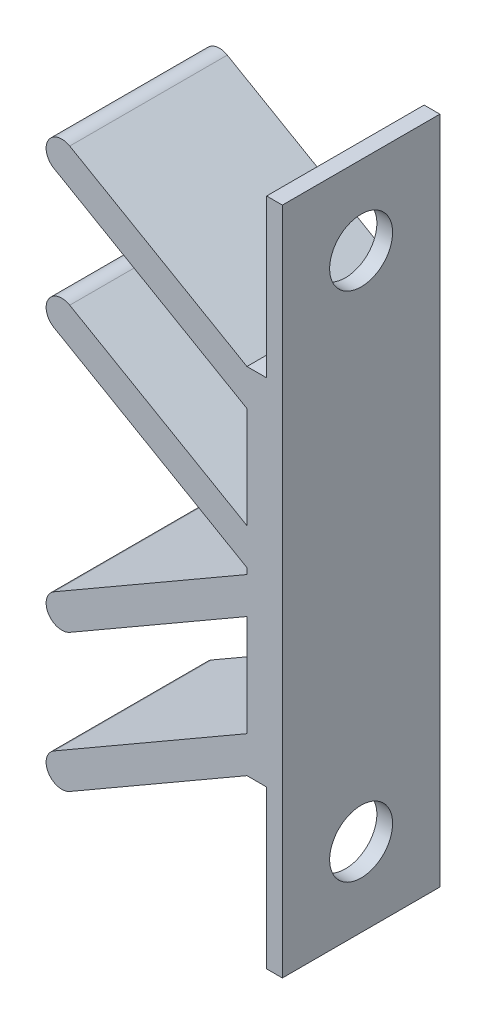
ISO-10303-21;
HEADER;
FILE_DESCRIPTION(('STEP AP214'),'2;1');
FILE_NAME('part.step','',(''),(''),'','','');
FILE_SCHEMA(('AUTOMOTIVE_DESIGN { 1 0 10303 214 1 1 1 1 }'));
ENDSEC;
DATA;
#1=APPLICATION_CONTEXT('core data for automotive mechanical design processes');
#2=APPLICATION_PROTOCOL_DEFINITION('international standard','automotive_design',2000,#1);
#3=PRODUCT_CONTEXT('',#1,'mechanical');
#4=PRODUCT('Part','Part','',(#3));
#5=PRODUCT_RELATED_PRODUCT_CATEGORY('part','',(#4));
#6=PRODUCT_DEFINITION_FORMATION('','',#4);
#7=PRODUCT_DEFINITION_CONTEXT('part definition',#1,'design');
#8=PRODUCT_DEFINITION('design','',#6,#7);
#9=PRODUCT_DEFINITION_SHAPE('','',#8);
#10=(LENGTH_UNIT() NAMED_UNIT(*) SI_UNIT(.MILLI.,.METRE.));
#11=(NAMED_UNIT(*) PLANE_ANGLE_UNIT() SI_UNIT($,.RADIAN.));
#12=(NAMED_UNIT(*) SI_UNIT($,.STERADIAN.) SOLID_ANGLE_UNIT());
#13=UNCERTAINTY_MEASURE_WITH_UNIT(LENGTH_MEASURE(1.E-05),#10,'distance_accuracy_value','');
#14=(GEOMETRIC_REPRESENTATION_CONTEXT(3) GLOBAL_UNCERTAINTY_ASSIGNED_CONTEXT((#13)) GLOBAL_UNIT_ASSIGNED_CONTEXT((#10,
#11,#12)) REPRESENTATION_CONTEXT('',''));
#15=CARTESIAN_POINT('',(0.,0.,0.));
#16=DIRECTION('',(0.,0.,1.));
#17=DIRECTION('',(1.,0.,0.));
#18=AXIS2_PLACEMENT_3D('',#15,#16,#17);
#19=CARTESIAN_POINT('',(6.17541167950552,-16.649176640989,8.));
#20=DIRECTION('',(-1.,0.,0.));
#21=DIRECTION('',(0.,0.,1.));
#22=AXIS2_PLACEMENT_3D('',#19,#20,#21);
#23=PLANE('',#22);
#24=CARTESIAN_POINT('',(6.17541167950552,13.350823359011,4.));
#25=DIRECTION('',(-1.,0.,0.));
#26=DIRECTION('',(0.,0.,1.));
#27=AXIS2_PLACEMENT_3D('',#24,#25,#26);
#28=CIRCLE('',#27,1.6);
#29=CARTESIAN_POINT('',(6.17541167950552,13.350823359011,5.6));
#30=VERTEX_POINT('',#29);
#31=EDGE_CURVE('E234',#30,#30,#28,.T.);
#32=ORIENTED_EDGE('',*,*,#31,.T.);
#33=EDGE_LOOP('',(#32));
#34=FACE_BOUND('',#33,.T.);
#35=CARTESIAN_POINT('',(6.17541167950552,-12.649176640989,4.));
#36=DIRECTION('',(-1.,0.,0.));
#37=DIRECTION('',(0.,0.,1.));
#38=AXIS2_PLACEMENT_3D('',#35,#36,#37);
#39=CIRCLE('',#38,1.6);
#40=CARTESIAN_POINT('',(6.17541167950552,-12.649176640989,5.6));
#41=VERTEX_POINT('',#40);
#42=EDGE_CURVE('E418',#41,#41,#39,.T.);
#43=ORIENTED_EDGE('',*,*,#42,.T.);
#44=EDGE_LOOP('',(#43));
#45=FACE_BOUND('',#44,.T.);
#46=DIRECTION('',(0.,1.,0.));
#47=VECTOR('',#46,1.);
#48=CARTESIAN_POINT('',(6.17541167950552,-16.649176640989,0.));
#49=LINE('',#48,#47);
#50=CARTESIAN_POINT('',(6.17541167950552,-16.649176640989,0.));
#51=VERTEX_POINT('',#50);
#52=CARTESIAN_POINT('',(6.17541167950552,17.350823359011,0.));
#53=VERTEX_POINT('',#52);
#54=EDGE_CURVE('E231',#51,#53,#49,.T.);
#55=ORIENTED_EDGE('',*,*,#54,.T.);
#56=DIRECTION('',(0.,0.,-1.));
#57=VECTOR('',#56,1.);
#58=CARTESIAN_POINT('',(6.17541167950552,17.350823359011,8.));
#59=LINE('',#58,#57);
#60=CARTESIAN_POINT('',(6.17541167950552,17.350823359011,8.));
#61=VERTEX_POINT('',#60);
#62=EDGE_CURVE('E13',#61,#53,#59,.T.);
#63=ORIENTED_EDGE('',*,*,#62,.F.);
#64=DIRECTION('',(0.,1.,0.));
#65=VECTOR('',#64,1.);
#66=CARTESIAN_POINT('',(6.17541167950552,-16.649176640989,8.));
#67=LINE('',#66,#65);
#68=CARTESIAN_POINT('',(6.17541167950552,-16.649176640989,8.));
#69=VERTEX_POINT('',#68);
#70=EDGE_CURVE('E273',#69,#61,#67,.T.);
#71=ORIENTED_EDGE('',*,*,#70,.F.);
#72=DIRECTION('',(0.,0.,-1.));
#73=VECTOR('',#72,1.);
#74=CARTESIAN_POINT('',(6.17541167950552,-16.649176640989,8.));
#75=LINE('',#74,#73);
#76=EDGE_CURVE('E230',#69,#51,#75,.T.);
#77=ORIENTED_EDGE('',*,*,#76,.T.);
#78=EDGE_LOOP('',(#55,#63,#71,#77));
#79=FACE_BOUND('',#78,.T.);
#80=ADVANCED_FACE('F51',(#34,#45,#79),#23,.F.);
#81=CARTESIAN_POINT('',(5.37541167950552,17.350823359011,8.));
#82=DIRECTION('',(0.,-1.,0.));
#83=DIRECTION('',(0.,0.,-1.));
#84=AXIS2_PLACEMENT_3D('',#81,#82,#83);
#85=PLANE('',#84);
#86=DIRECTION('',(-1.,0.,0.));
#87=VECTOR('',#86,1.);
#88=CARTESIAN_POINT('',(5.37541167950552,17.350823359011,0.));
#89=LINE('',#88,#87);
#90=CARTESIAN_POINT('',(5.37541167950552,17.350823359011,0.));
#91=VERTEX_POINT('',#90);
#92=EDGE_CURVE('E233',#53,#91,#89,.T.);
#93=ORIENTED_EDGE('',*,*,#92,.T.);
#94=DIRECTION('',(0.,0.,-1.));
#95=VECTOR('',#94,1.);
#96=CARTESIAN_POINT('',(5.37541167950552,17.350823359011,8.));
#97=LINE('',#96,#95);
#98=CARTESIAN_POINT('',(5.37541167950552,17.350823359011,8.));
#99=VERTEX_POINT('',#98);
#100=EDGE_CURVE('E56',#99,#91,#97,.T.);
#101=ORIENTED_EDGE('',*,*,#100,.F.);
#102=DIRECTION('',(-1.,0.,0.));
#103=VECTOR('',#102,1.);
#104=CARTESIAN_POINT('',(5.37541167950552,17.350823359011,8.));
#105=LINE('',#104,#103);
#106=EDGE_CURVE('E155',#61,#99,#105,.T.);
#107=ORIENTED_EDGE('',*,*,#106,.F.);
#108=ORIENTED_EDGE('',*,*,#62,.T.);
#109=EDGE_LOOP('',(#93,#101,#107,#108));
#110=FACE_BOUND('',#109,.T.);
#111=ADVANCED_FACE('F404',(#110),#85,.F.);
#112=CARTESIAN_POINT('',(5.37541167950552,9.35082335901104,8.));
#113=DIRECTION('',(1.,0.,0.));
#114=DIRECTION('',(0.,0.,-1.));
#115=AXIS2_PLACEMENT_3D('',#112,#113,#114);
#116=PLANE('',#115);
#117=CARTESIAN_POINT('',(5.37541167950552,13.350823359011,4.));
#118=DIRECTION('',(-1.,0.,0.));
#119=DIRECTION('',(0.,0.,1.));
#120=AXIS2_PLACEMENT_3D('',#117,#118,#119);
#121=CIRCLE('',#120,1.6);
#122=CARTESIAN_POINT('',(5.37541167950552,13.350823359011,5.6));
#123=VERTEX_POINT('',#122);
#124=EDGE_CURVE('E416',#123,#123,#121,.T.);
#125=ORIENTED_EDGE('',*,*,#124,.F.);
#126=EDGE_LOOP('',(#125));
#127=FACE_BOUND('',#126,.T.);
#128=DIRECTION('',(0.,-1.,0.));
#129=VECTOR('',#128,1.);
#130=CARTESIAN_POINT('',(5.37541167950552,9.35082335901104,0.));
#131=LINE('',#130,#129);
#132=CARTESIAN_POINT('',(5.37541167950552,9.35082335901104,0.));
#133=VERTEX_POINT('',#132);
#134=EDGE_CURVE('E240',#91,#133,#131,.T.);
#135=ORIENTED_EDGE('',*,*,#134,.T.);
#136=DIRECTION('',(0.,0.,-1.));
#137=VECTOR('',#136,1.);
#138=CARTESIAN_POINT('',(5.37541167950552,9.35082335901104,8.));
#139=LINE('',#138,#137);
#140=CARTESIAN_POINT('',(5.37541167950552,9.35082335901104,8.));
#141=VERTEX_POINT('',#140);
#142=EDGE_CURVE('E323',#141,#133,#139,.T.);
#143=ORIENTED_EDGE('',*,*,#142,.F.);
#144=DIRECTION('',(0.,-1.,0.));
#145=VECTOR('',#144,1.);
#146=CARTESIAN_POINT('',(5.37541167950552,9.35082335901104,8.));
#147=LINE('',#146,#145);
#148=EDGE_CURVE('E332',#99,#141,#147,.T.);
#149=ORIENTED_EDGE('',*,*,#148,.F.);
#150=ORIENTED_EDGE('',*,*,#100,.T.);
#151=EDGE_LOOP('',(#135,#143,#149,#150));
#152=FACE_BOUND('',#151,.T.);
#153=ADVANCED_FACE('F328',(#127,#152),#116,.F.);
#154=CARTESIAN_POINT('',(4.37541167950552,9.35082335901104,8.));
#155=DIRECTION('',(0.,-1.,0.));
#156=DIRECTION('',(0.,0.,-1.));
#157=AXIS2_PLACEMENT_3D('',#154,#155,#156);
#158=PLANE('',#157);
#159=DIRECTION('',(-1.,0.,0.));
#160=VECTOR('',#159,1.);
#161=CARTESIAN_POINT('',(4.37541167950552,9.35082335901104,0.));
#162=LINE('',#161,#160);
#163=CARTESIAN_POINT('',(4.37541167950552,9.35082335901104,0.));
#164=VERTEX_POINT('',#163);
#165=EDGE_CURVE('E239',#133,#164,#162,.T.);
#166=ORIENTED_EDGE('',*,*,#165,.T.);
#167=DIRECTION('',(0.,0.,-1.));
#168=VECTOR('',#167,1.);
#169=CARTESIAN_POINT('',(4.37541167950552,9.35082335901104,8.));
#170=LINE('',#169,#168);
#171=CARTESIAN_POINT('',(4.37541167950552,9.35082335901104,8.));
#172=VERTEX_POINT('',#171);
#173=EDGE_CURVE('E319',#172,#164,#170,.T.);
#174=ORIENTED_EDGE('',*,*,#173,.F.);
#175=DIRECTION('',(-1.,0.,0.));
#176=VECTOR('',#175,1.);
#177=CARTESIAN_POINT('',(4.37541167950552,9.35082335901104,8.));
#178=LINE('',#177,#176);
#179=EDGE_CURVE('E349',#141,#172,#178,.T.);
#180=ORIENTED_EDGE('',*,*,#179,.F.);
#181=ORIENTED_EDGE('',*,*,#142,.T.);
#182=EDGE_LOOP('',(#166,#174,#180,#181));
#183=FACE_BOUND('',#182,.T.);
#184=ADVANCED_FACE('F338',(#183),#158,.F.);
#185=CARTESIAN_POINT('',(-4.62458832049448,14.5469757817177,8.));
#186=DIRECTION('',(-0.499999999999999,-0.866025403784439,0.));
#187=DIRECTION('',(0.866025403784439,-0.499999999999999,0.));
#188=AXIS2_PLACEMENT_3D('',#185,#186,#187);
#189=PLANE('',#188);
#190=DIRECTION('',(-0.866025403784439,0.499999999999999,0.));
#191=VECTOR('',#190,1.);
#192=CARTESIAN_POINT('',(-4.62458832049448,14.5469757817177,0.));
#193=LINE('',#192,#191);
#194=CARTESIAN_POINT('',(-4.62458832049448,14.5469757817177,0.));
#195=VERTEX_POINT('',#194);
#196=EDGE_CURVE('E242',#164,#195,#193,.T.);
#197=ORIENTED_EDGE('',*,*,#196,.T.);
#198=DIRECTION('',(0.,0.,-1.));
#199=VECTOR('',#198,1.);
#200=CARTESIAN_POINT('',(-4.62458832049448,14.5469757817177,8.));
#201=LINE('',#200,#199);
#202=CARTESIAN_POINT('',(-4.62458832049448,14.5469757817177,8.));
#203=VERTEX_POINT('',#202);
#204=EDGE_CURVE('E320',#203,#195,#201,.T.);
#205=ORIENTED_EDGE('',*,*,#204,.F.);
#206=DIRECTION('',(-0.866025403784439,0.499999999999999,0.));
#207=VECTOR('',#206,1.);
#208=CARTESIAN_POINT('',(-4.62458832049448,14.5469757817177,8.));
#209=LINE('',#208,#207);
#210=EDGE_CURVE('E347',#172,#203,#209,.T.);
#211=ORIENTED_EDGE('',*,*,#210,.F.);
#212=ORIENTED_EDGE('',*,*,#173,.T.);
#213=EDGE_LOOP('',(#197,#205,#211,#212));
#214=FACE_BOUND('',#213,.T.);
#215=ADVANCED_FACE('F343',(#214),#189,.F.);
#216=CARTESIAN_POINT('',(-5.02458832049448,13.8541554586901,8.));
#217=DIRECTION('',(0.,0.,-1.));
#218=DIRECTION('',(-1.,0.,0.));
#219=AXIS2_PLACEMENT_3D('',#216,#217,#218);
#220=CYLINDRICAL_SURFACE('',#219,0.799999999999999);
#221=CARTESIAN_POINT('',(-5.02458832049448,13.8541554586901,0.));
#222=DIRECTION('',(0.,0.,1.));
#223=DIRECTION('',(1.,0.,0.));
#224=AXIS2_PLACEMENT_3D('',#221,#222,#223);
#225=CIRCLE('',#224,0.799999999999999);
#226=CARTESIAN_POINT('',(-5.42458832049448,13.1613351356626,0.));
#227=VERTEX_POINT('',#226);
#228=EDGE_CURVE('E244',#195,#227,#225,.T.);
#229=ORIENTED_EDGE('',*,*,#228,.T.);
#230=DIRECTION('',(0.,0.,-1.));
#231=VECTOR('',#230,1.);
#232=CARTESIAN_POINT('',(-5.42458832049448,13.1613351356626,8.));
#233=LINE('',#232,#231);
#234=CARTESIAN_POINT('',(-5.42458832049448,13.1613351356626,8.));
#235=VERTEX_POINT('',#234);
#236=EDGE_CURVE('E314',#235,#227,#233,.T.);
#237=ORIENTED_EDGE('',*,*,#236,.F.);
#238=CARTESIAN_POINT('',(-5.02458832049448,13.8541554586901,8.));
#239=DIRECTION('',(0.,0.,1.));
#240=DIRECTION('',(1.,0.,0.));
#241=AXIS2_PLACEMENT_3D('',#238,#239,#240);
#242=CIRCLE('',#241,0.799999999999999);
#243=EDGE_CURVE('E346',#203,#235,#242,.T.);
#244=ORIENTED_EDGE('',*,*,#243,.F.);
#245=ORIENTED_EDGE('',*,*,#204,.T.);
#246=EDGE_LOOP('',(#229,#237,#244,#245));
#247=FACE_BOUND('',#246,.T.);
#248=ADVANCED_FACE('F587',(#247),#220,.T.);
#249=CARTESIAN_POINT('',(4.37541167950552,7.50330249760424,8.));
#250=DIRECTION('',(0.499999999999999,0.866025403784439,0.));
#251=DIRECTION('',(-0.866025403784439,0.499999999999999,0.));
#252=AXIS2_PLACEMENT_3D('',#249,#250,#251);
#253=PLANE('',#252);
#254=DIRECTION('',(0.866025403784439,-0.499999999999999,0.));
#255=VECTOR('',#254,1.);
#256=CARTESIAN_POINT('',(4.37541167950552,7.50330249760424,0.));
#257=LINE('',#256,#255);
#258=CARTESIAN_POINT('',(4.37541167950552,7.50330249760424,0.));
#259=VERTEX_POINT('',#258);
#260=EDGE_CURVE('E243',#227,#259,#257,.T.);
#261=ORIENTED_EDGE('',*,*,#260,.T.);
#262=DIRECTION('',(0.,0.,-1.));
#263=VECTOR('',#262,1.);
#264=CARTESIAN_POINT('',(4.37541167950552,7.50330249760424,8.));
#265=LINE('',#264,#263);
#266=CARTESIAN_POINT('',(4.37541167950552,7.50330249760424,8.));
#267=VERTEX_POINT('',#266);
#268=EDGE_CURVE('E313',#267,#259,#265,.T.);
#269=ORIENTED_EDGE('',*,*,#268,.F.);
#270=DIRECTION('',(0.866025403784439,-0.499999999999999,0.));
#271=VECTOR('',#270,1.);
#272=CARTESIAN_POINT('',(4.37541167950552,7.50330249760424,8.));
#273=LINE('',#272,#271);
#274=EDGE_CURVE('E352',#235,#267,#273,.T.);
#275=ORIENTED_EDGE('',*,*,#274,.F.);
#276=ORIENTED_EDGE('',*,*,#236,.T.);
#277=EDGE_LOOP('',(#261,#269,#275,#276));
#278=FACE_BOUND('',#277,.T.);
#279=ADVANCED_FACE('F579',(#278),#253,.F.);
#280=CARTESIAN_POINT('',(4.37541167950552,2.35082335901104,8.));
#281=DIRECTION('',(1.,0.,0.));
#282=DIRECTION('',(0.,0.,-1.));
#283=AXIS2_PLACEMENT_3D('',#280,#281,#282);
#284=PLANE('',#283);
#285=DIRECTION('',(0.,-1.,0.));
#286=VECTOR('',#285,1.);
#287=CARTESIAN_POINT('',(4.37541167950552,2.35082335901104,0.));
#288=LINE('',#287,#286);
#289=CARTESIAN_POINT('',(4.37541167950552,2.35082335901104,0.));
#290=VERTEX_POINT('',#289);
#291=EDGE_CURVE('E250',#259,#290,#288,.T.);
#292=ORIENTED_EDGE('',*,*,#291,.T.);
#293=DIRECTION('',(0.,0.,-1.));
#294=VECTOR('',#293,1.);
#295=CARTESIAN_POINT('',(4.37541167950552,2.35082335901104,8.));
#296=LINE('',#295,#294);
#297=CARTESIAN_POINT('',(4.37541167950552,2.35082335901104,8.));
#298=VERTEX_POINT('',#297);
#299=EDGE_CURVE('E306',#298,#290,#296,.T.);
#300=ORIENTED_EDGE('',*,*,#299,.F.);
#301=DIRECTION('',(0.,-1.,0.));
#302=VECTOR('',#301,1.);
#303=CARTESIAN_POINT('',(4.37541167950552,2.35082335901104,8.));
#304=LINE('',#303,#302);
#305=EDGE_CURVE('E360',#267,#298,#304,.T.);
#306=ORIENTED_EDGE('',*,*,#305,.F.);
#307=ORIENTED_EDGE('',*,*,#268,.T.);
#308=EDGE_LOOP('',(#292,#300,#306,#307));
#309=FACE_BOUND('',#308,.T.);
#310=ADVANCED_FACE('F568',(#309),#284,.F.);
#311=CARTESIAN_POINT('',(-4.62458832049448,7.54697578171767,8.));
#312=DIRECTION('',(-0.5,-0.866025403784439,0.));
#313=DIRECTION('',(0.866025403784439,-0.5,0.));
#314=AXIS2_PLACEMENT_3D('',#311,#312,#313);
#315=PLANE('',#314);
#316=DIRECTION('',(-0.866025403784439,0.5,0.));
#317=VECTOR('',#316,1.);
#318=CARTESIAN_POINT('',(-4.62458832049448,7.54697578171767,0.));
#319=LINE('',#318,#317);
#320=CARTESIAN_POINT('',(-4.62458832049448,7.54697578171767,0.));
#321=VERTEX_POINT('',#320);
#322=EDGE_CURVE('E248',#290,#321,#319,.T.);
#323=ORIENTED_EDGE('',*,*,#322,.T.);
#324=DIRECTION('',(0.,0.,-1.));
#325=VECTOR('',#324,1.);
#326=CARTESIAN_POINT('',(-4.62458832049448,7.54697578171767,8.));
#327=LINE('',#326,#325);
#328=CARTESIAN_POINT('',(-4.62458832049448,7.54697578171767,8.));
#329=VERTEX_POINT('',#328);
#330=EDGE_CURVE('E304',#329,#321,#327,.T.);
#331=ORIENTED_EDGE('',*,*,#330,.F.);
#332=DIRECTION('',(-0.866025403784439,0.5,0.));
#333=VECTOR('',#332,1.);
#334=CARTESIAN_POINT('',(-4.62458832049448,7.54697578171767,8.));
#335=LINE('',#334,#333);
#336=EDGE_CURVE('E358',#298,#329,#335,.T.);
#337=ORIENTED_EDGE('',*,*,#336,.F.);
#338=ORIENTED_EDGE('',*,*,#299,.T.);
#339=EDGE_LOOP('',(#323,#331,#337,#338));
#340=FACE_BOUND('',#339,.T.);
#341=ADVANCED_FACE('F558',(#340),#315,.F.);
#342=CARTESIAN_POINT('',(-5.02458832049448,6.85415545869012,8.));
#343=DIRECTION('',(0.,0.,-1.));
#344=DIRECTION('',(-1.,0.,0.));
#345=AXIS2_PLACEMENT_3D('',#342,#343,#344);
#346=CYLINDRICAL_SURFACE('',#345,0.799999999999999);
#347=CARTESIAN_POINT('',(-5.02458832049448,6.85415545869012,0.));
#348=DIRECTION('',(0.,0.,1.));
#349=DIRECTION('',(1.,0.,0.));
#350=AXIS2_PLACEMENT_3D('',#347,#348,#349);
#351=CIRCLE('',#350,0.799999999999999);
#352=CARTESIAN_POINT('',(-5.42458832049448,6.16133513566257,0.));
#353=VERTEX_POINT('',#352);
#354=EDGE_CURVE('E253',#321,#353,#351,.T.);
#355=ORIENTED_EDGE('',*,*,#354,.T.);
#356=DIRECTION('',(0.,0.,-1.));
#357=VECTOR('',#356,1.);
#358=CARTESIAN_POINT('',(-5.42458832049448,6.16133513566257,8.));
#359=LINE('',#358,#357);
#360=CARTESIAN_POINT('',(-5.42458832049448,6.16133513566257,8.));
#361=VERTEX_POINT('',#360);
#362=EDGE_CURVE('E305',#361,#353,#359,.T.);
#363=ORIENTED_EDGE('',*,*,#362,.F.);
#364=CARTESIAN_POINT('',(-5.02458832049448,6.85415545869012,8.));
#365=DIRECTION('',(0.,0.,1.));
#366=DIRECTION('',(1.,0.,0.));
#367=AXIS2_PLACEMENT_3D('',#364,#365,#366);
#368=CIRCLE('',#367,0.799999999999999);
#369=EDGE_CURVE('E363',#329,#361,#368,.T.);
#370=ORIENTED_EDGE('',*,*,#369,.F.);
#371=ORIENTED_EDGE('',*,*,#330,.T.);
#372=EDGE_LOOP('',(#355,#363,#370,#371));
#373=FACE_BOUND('',#372,.T.);
#374=ADVANCED_FACE('F549',(#373),#346,.T.);
#375=CARTESIAN_POINT('',(4.37541167950552,0.50330249760424,8.));
#376=DIRECTION('',(0.5,0.866025403784438,0.));
#377=DIRECTION('',(-0.866025403784439,0.5,0.));
#378=AXIS2_PLACEMENT_3D('',#375,#376,#377);
#379=PLANE('',#378);
#380=DIRECTION('',(0.866025403784439,-0.5,0.));
#381=VECTOR('',#380,1.);
#382=CARTESIAN_POINT('',(4.37541167950552,0.50330249760424,0.));
#383=LINE('',#382,#381);
#384=CARTESIAN_POINT('',(4.37541167950552,0.50330249760424,0.));
#385=VERTEX_POINT('',#384);
#386=EDGE_CURVE('E251',#353,#385,#383,.T.);
#387=ORIENTED_EDGE('',*,*,#386,.T.);
#388=DIRECTION('',(0.,0.,-1.));
#389=VECTOR('',#388,1.);
#390=CARTESIAN_POINT('',(4.37541167950552,0.50330249760424,8.));
#391=LINE('',#390,#389);
#392=CARTESIAN_POINT('',(4.37541167950552,0.50330249760424,8.));
#393=VERTEX_POINT('',#392);
#394=EDGE_CURVE('E296',#393,#385,#391,.T.);
#395=ORIENTED_EDGE('',*,*,#394,.F.);
#396=DIRECTION('',(0.866025403784439,-0.5,0.));
#397=VECTOR('',#396,1.);
#398=CARTESIAN_POINT('',(4.37541167950552,0.50330249760424,8.));
#399=LINE('',#398,#397);
#400=EDGE_CURVE('E361',#361,#393,#399,.T.);
#401=ORIENTED_EDGE('',*,*,#400,.F.);
#402=ORIENTED_EDGE('',*,*,#362,.T.);
#403=EDGE_LOOP('',(#387,#395,#401,#402));
#404=FACE_BOUND('',#403,.T.);
#405=ADVANCED_FACE('F539',(#404),#379,.F.);
#406=CARTESIAN_POINT('',(4.37541167950552,0.198344220417847,8.));
#407=DIRECTION('',(1.,0.,0.));
#408=DIRECTION('',(0.,0.,-1.));
#409=AXIS2_PLACEMENT_3D('',#406,#407,#408);
#410=PLANE('',#409);
#411=DIRECTION('',(0.,-1.,0.));
#412=VECTOR('',#411,1.);
#413=CARTESIAN_POINT('',(4.37541167950552,0.198344220417847,0.));
#414=LINE('',#413,#412);
#415=CARTESIAN_POINT('',(4.37541167950552,0.198344220417847,0.));
#416=VERTEX_POINT('',#415);
#417=EDGE_CURVE('E254',#385,#416,#414,.T.);
#418=ORIENTED_EDGE('',*,*,#417,.T.);
#419=DIRECTION('',(0.,0.,-1.));
#420=VECTOR('',#419,1.);
#421=CARTESIAN_POINT('',(4.37541167950552,0.198344220417847,8.));
#422=LINE('',#421,#420);
#423=CARTESIAN_POINT('',(4.37541167950552,0.198344220417847,8.));
#424=VERTEX_POINT('',#423);
#425=EDGE_CURVE('E297',#424,#416,#422,.T.);
#426=ORIENTED_EDGE('',*,*,#425,.F.);
#427=DIRECTION('',(0.,-1.,0.));
#428=VECTOR('',#427,1.);
#429=CARTESIAN_POINT('',(4.37541167950552,0.198344220417847,8.));
#430=LINE('',#429,#428);
#431=EDGE_CURVE('E364',#393,#424,#430,.T.);
#432=ORIENTED_EDGE('',*,*,#431,.F.);
#433=ORIENTED_EDGE('',*,*,#394,.T.);
#434=EDGE_LOOP('',(#418,#426,#432,#433));
#435=FACE_BOUND('',#434,.T.);
#436=ADVANCED_FACE('F529',(#435),#410,.F.);
#437=CARTESIAN_POINT('',(-5.42458832049448,-5.45968841764049,8.));
#438=DIRECTION('',(0.5,-0.866025403784438,0.));
#439=DIRECTION('',(0.866025403784439,0.5,0.));
#440=AXIS2_PLACEMENT_3D('',#437,#438,#439);
#441=PLANE('',#440);
#442=DIRECTION('',(-0.866025403784439,-0.5,0.));
#443=VECTOR('',#442,1.);
#444=CARTESIAN_POINT('',(-5.42458832049448,-5.45968841764049,0.));
#445=LINE('',#444,#443);
#446=CARTESIAN_POINT('',(-5.42458832049448,-5.45968841764049,0.));
#447=VERTEX_POINT('',#446);
#448=EDGE_CURVE('E260',#416,#447,#445,.T.);
#449=ORIENTED_EDGE('',*,*,#448,.T.);
#450=DIRECTION('',(0.,0.,-1.));
#451=VECTOR('',#450,1.);
#452=CARTESIAN_POINT('',(-5.42458832049448,-5.45968841764049,8.));
#453=LINE('',#452,#451);
#454=CARTESIAN_POINT('',(-5.42458832049448,-5.45968841764049,8.));
#455=VERTEX_POINT('',#454);
#456=EDGE_CURVE('E291',#455,#447,#453,.T.);
#457=ORIENTED_EDGE('',*,*,#456,.F.);
#458=DIRECTION('',(-0.866025403784439,-0.5,0.));
#459=VECTOR('',#458,1.);
#460=CARTESIAN_POINT('',(-5.42458832049448,-5.45968841764049,8.));
#461=LINE('',#460,#459);
#462=EDGE_CURVE('E370',#424,#455,#461,.T.);
#463=ORIENTED_EDGE('',*,*,#462,.F.);
#464=ORIENTED_EDGE('',*,*,#425,.T.);
#465=EDGE_LOOP('',(#449,#457,#463,#464));
#466=FACE_BOUND('',#465,.T.);
#467=ADVANCED_FACE('F518',(#466),#441,.F.);
#468=CARTESIAN_POINT('',(-5.02458832049448,-6.15250874066804,8.));
#469=DIRECTION('',(0.,0.,-1.));
#470=DIRECTION('',(-1.,0.,0.));
#471=AXIS2_PLACEMENT_3D('',#468,#469,#470);
#472=CYLINDRICAL_SURFACE('',#471,0.799999999999999);
#473=CARTESIAN_POINT('',(-5.02458832049448,-6.15250874066804,0.));
#474=DIRECTION('',(0.,0.,1.));
#475=DIRECTION('',(1.,0.,0.));
#476=AXIS2_PLACEMENT_3D('',#473,#474,#475);
#477=CIRCLE('',#476,0.799999999999999);
#478=CARTESIAN_POINT('',(-4.62458832049448,-6.84532906369559,0.));
#479=VERTEX_POINT('',#478);
#480=EDGE_CURVE('E259',#447,#479,#477,.T.);
#481=ORIENTED_EDGE('',*,*,#480,.T.);
#482=DIRECTION('',(0.,0.,-1.));
#483=VECTOR('',#482,1.);
#484=CARTESIAN_POINT('',(-4.62458832049448,-6.84532906369559,8.));
#485=LINE('',#484,#483);
#486=CARTESIAN_POINT('',(-4.62458832049448,-6.84532906369559,8.));
#487=VERTEX_POINT('',#486);
#488=EDGE_CURVE('E289',#487,#479,#485,.T.);
#489=ORIENTED_EDGE('',*,*,#488,.F.);
#490=CARTESIAN_POINT('',(-5.02458832049448,-6.15250874066804,8.));
#491=DIRECTION('',(0.,0.,1.));
#492=DIRECTION('',(1.,0.,0.));
#493=AXIS2_PLACEMENT_3D('',#490,#491,#492);
#494=CIRCLE('',#493,0.799999999999999);
#495=EDGE_CURVE('E369',#455,#487,#494,.T.);
#496=ORIENTED_EDGE('',*,*,#495,.F.);
#497=ORIENTED_EDGE('',*,*,#456,.T.);
#498=EDGE_LOOP('',(#481,#489,#496,#497));
#499=FACE_BOUND('',#498,.T.);
#500=ADVANCED_FACE('F509',(#499),#472,.T.);
#501=CARTESIAN_POINT('',(4.37541167950552,-1.64917664098896,8.));
#502=DIRECTION('',(-0.5,0.866025403784439,0.));
#503=DIRECTION('',(-0.866025403784439,-0.5,0.));
#504=AXIS2_PLACEMENT_3D('',#501,#502,#503);
#505=PLANE('',#504);
#506=DIRECTION('',(0.866025403784439,0.5,0.));
#507=VECTOR('',#506,1.);
#508=CARTESIAN_POINT('',(4.37541167950552,-1.64917664098896,0.));
#509=LINE('',#508,#507);
#510=CARTESIAN_POINT('',(4.37541167950552,-1.64917664098896,0.));
#511=VERTEX_POINT('',#510);
#512=EDGE_CURVE('E261',#479,#511,#509,.T.);
#513=ORIENTED_EDGE('',*,*,#512,.T.);
#514=DIRECTION('',(0.,0.,-1.));
#515=VECTOR('',#514,1.);
#516=CARTESIAN_POINT('',(4.37541167950552,-1.64917664098896,8.));
#517=LINE('',#516,#515);
#518=CARTESIAN_POINT('',(4.37541167950552,-1.64917664098896,8.));
#519=VERTEX_POINT('',#518);
#520=EDGE_CURVE('E290',#519,#511,#517,.T.);
#521=ORIENTED_EDGE('',*,*,#520,.F.);
#522=DIRECTION('',(0.866025403784439,0.5,0.));
#523=VECTOR('',#522,1.);
#524=CARTESIAN_POINT('',(4.37541167950552,-1.64917664098896,8.));
#525=LINE('',#524,#523);
#526=EDGE_CURVE('E371',#487,#519,#525,.T.);
#527=ORIENTED_EDGE('',*,*,#526,.F.);
#528=ORIENTED_EDGE('',*,*,#488,.T.);
#529=EDGE_LOOP('',(#513,#521,#527,#528));
#530=FACE_BOUND('',#529,.T.);
#531=ADVANCED_FACE('F498',(#530),#505,.F.);
#532=CARTESIAN_POINT('',(4.37541167950552,-6.80165577958216,8.));
#533=DIRECTION('',(1.,0.,0.));
#534=DIRECTION('',(0.,0.,-1.));
#535=AXIS2_PLACEMENT_3D('',#532,#533,#534);
#536=PLANE('',#535);
#537=DIRECTION('',(0.,-1.,0.));
#538=VECTOR('',#537,1.);
#539=CARTESIAN_POINT('',(4.37541167950552,-6.80165577958216,0.));
#540=LINE('',#539,#538);
#541=CARTESIAN_POINT('',(4.37541167950552,-6.80165577958216,0.));
#542=VERTEX_POINT('',#541);
#543=EDGE_CURVE('E263',#511,#542,#540,.T.);
#544=ORIENTED_EDGE('',*,*,#543,.T.);
#545=DIRECTION('',(0.,0.,-1.));
#546=VECTOR('',#545,1.);
#547=CARTESIAN_POINT('',(4.37541167950552,-6.80165577958216,8.));
#548=LINE('',#547,#546);
#549=CARTESIAN_POINT('',(4.37541167950552,-6.80165577958216,8.));
#550=VERTEX_POINT('',#549);
#551=EDGE_CURVE('E281',#550,#542,#548,.T.);
#552=ORIENTED_EDGE('',*,*,#551,.F.);
#553=DIRECTION('',(0.,-1.,0.));
#554=VECTOR('',#553,1.);
#555=CARTESIAN_POINT('',(4.37541167950552,-6.80165577958216,8.));
#556=LINE('',#555,#554);
#557=EDGE_CURVE('E373',#519,#550,#556,.T.);
#558=ORIENTED_EDGE('',*,*,#557,.F.);
#559=ORIENTED_EDGE('',*,*,#520,.T.);
#560=EDGE_LOOP('',(#544,#552,#558,#559));
#561=FACE_BOUND('',#560,.T.);
#562=ADVANCED_FACE('F489',(#561),#536,.F.);
#563=CARTESIAN_POINT('',(-5.42458832049448,-12.4596884176405,8.));
#564=DIRECTION('',(0.499999999999999,-0.866025403784439,0.));
#565=DIRECTION('',(0.866025403784439,0.499999999999999,0.));
#566=AXIS2_PLACEMENT_3D('',#563,#564,#565);
#567=PLANE('',#566);
#568=DIRECTION('',(-0.866025403784439,-0.499999999999999,0.));
#569=VECTOR('',#568,1.);
#570=CARTESIAN_POINT('',(-5.42458832049448,-12.4596884176405,0.));
#571=LINE('',#570,#569);
#572=CARTESIAN_POINT('',(-5.42458832049448,-12.4596884176405,0.));
#573=VERTEX_POINT('',#572);
#574=EDGE_CURVE('E264',#542,#573,#571,.T.);
#575=ORIENTED_EDGE('',*,*,#574,.T.);
#576=DIRECTION('',(0.,0.,-1.));
#577=VECTOR('',#576,1.);
#578=CARTESIAN_POINT('',(-5.42458832049448,-12.4596884176405,8.));
#579=LINE('',#578,#577);
#580=CARTESIAN_POINT('',(-5.42458832049448,-12.4596884176405,8.));
#581=VERTEX_POINT('',#580);
#582=EDGE_CURVE('E282',#581,#573,#579,.T.);
#583=ORIENTED_EDGE('',*,*,#582,.F.);
#584=DIRECTION('',(-0.866025403784439,-0.499999999999999,0.));
#585=VECTOR('',#584,1.);
#586=CARTESIAN_POINT('',(-5.42458832049448,-12.4596884176405,8.));
#587=LINE('',#586,#585);
#588=EDGE_CURVE('E374',#550,#581,#587,.T.);
#589=ORIENTED_EDGE('',*,*,#588,.F.);
#590=ORIENTED_EDGE('',*,*,#551,.T.);
#591=EDGE_LOOP('',(#575,#583,#589,#590));
#592=FACE_BOUND('',#591,.T.);
#593=ADVANCED_FACE('F481',(#592),#567,.F.);
#594=CARTESIAN_POINT('',(-5.02458832049448,-13.152508740668,8.));
#595=DIRECTION('',(0.,0.,-1.));
#596=DIRECTION('',(-1.,0.,0.));
#597=AXIS2_PLACEMENT_3D('',#594,#595,#596);
#598=CYLINDRICAL_SURFACE('',#597,0.799999999999999);
#599=CARTESIAN_POINT('',(-5.02458832049448,-13.152508740668,0.));
#600=DIRECTION('',(0.,0.,1.));
#601=DIRECTION('',(1.,0.,0.));
#602=AXIS2_PLACEMENT_3D('',#599,#600,#601);
#603=CIRCLE('',#602,0.799999999999999);
#604=CARTESIAN_POINT('',(-4.62458832049448,-13.8453290636956,0.));
#605=VERTEX_POINT('',#604);
#606=EDGE_CURVE('E270',#573,#605,#603,.T.);
#607=ORIENTED_EDGE('',*,*,#606,.T.);
#608=DIRECTION('',(0.,0.,-1.));
#609=VECTOR('',#608,1.);
#610=CARTESIAN_POINT('',(-4.62458832049448,-13.8453290636956,8.));
#611=LINE('',#610,#609);
#612=CARTESIAN_POINT('',(-4.62458832049448,-13.8453290636956,8.));
#613=VERTEX_POINT('',#612);
#614=EDGE_CURVE('E279',#613,#605,#611,.T.);
#615=ORIENTED_EDGE('',*,*,#614,.F.);
#616=CARTESIAN_POINT('',(-5.02458832049448,-13.152508740668,8.));
#617=DIRECTION('',(0.,0.,1.));
#618=DIRECTION('',(1.,0.,0.));
#619=AXIS2_PLACEMENT_3D('',#616,#617,#618);
#620=CIRCLE('',#619,0.799999999999999);
#621=EDGE_CURVE('E380',#581,#613,#620,.T.);
#622=ORIENTED_EDGE('',*,*,#621,.F.);
#623=ORIENTED_EDGE('',*,*,#582,.T.);
#624=EDGE_LOOP('',(#607,#615,#622,#623));
#625=FACE_BOUND('',#624,.T.);
#626=ADVANCED_FACE('F382',(#625),#598,.T.);
#627=CARTESIAN_POINT('',(4.37541167950552,-8.64917664098896,8.));
#628=DIRECTION('',(-0.499999999999999,0.866025403784439,0.));
#629=DIRECTION('',(-0.866025403784439,-0.499999999999999,0.));
#630=AXIS2_PLACEMENT_3D('',#627,#628,#629);
#631=PLANE('',#630);
#632=DIRECTION('',(0.866025403784439,0.499999999999999,0.));
#633=VECTOR('',#632,1.);
#634=CARTESIAN_POINT('',(4.37541167950552,-8.64917664098896,0.));
#635=LINE('',#634,#633);
#636=CARTESIAN_POINT('',(4.37541167950552,-8.64917664098896,0.));
#637=VERTEX_POINT('',#636);
#638=EDGE_CURVE('E267',#605,#637,#635,.T.);
#639=ORIENTED_EDGE('',*,*,#638,.T.);
#640=DIRECTION('',(0.,0.,-1.));
#641=VECTOR('',#640,1.);
#642=CARTESIAN_POINT('',(4.37541167950552,-8.64917664098896,8.));
#643=LINE('',#642,#641);
#644=CARTESIAN_POINT('',(4.37541167950552,-8.64917664098896,8.));
#645=VERTEX_POINT('',#644);
#646=EDGE_CURVE('E225',#645,#637,#643,.T.);
#647=ORIENTED_EDGE('',*,*,#646,.F.);
#648=DIRECTION('',(0.866025403784439,0.499999999999999,0.));
#649=VECTOR('',#648,1.);
#650=CARTESIAN_POINT('',(4.37541167950552,-8.64917664098896,8.));
#651=LINE('',#650,#649);
#652=EDGE_CURVE('E213',#613,#645,#651,.T.);
#653=ORIENTED_EDGE('',*,*,#652,.F.);
#654=ORIENTED_EDGE('',*,*,#614,.T.);
#655=EDGE_LOOP('',(#639,#647,#653,#654));
#656=FACE_BOUND('',#655,.T.);
#657=ADVANCED_FACE('F390',(#656),#631,.F.);
#658=CARTESIAN_POINT('',(5.37541167950552,-8.64917664098896,8.));
#659=DIRECTION('',(0.,1.,0.));
#660=DIRECTION('',(0.,0.,1.));
#661=AXIS2_PLACEMENT_3D('',#658,#659,#660);
#662=PLANE('',#661);
#663=DIRECTION('',(1.,0.,0.));
#664=VECTOR('',#663,1.);
#665=CARTESIAN_POINT('',(5.37541167950552,-8.64917664098896,0.));
#666=LINE('',#665,#664);
#667=CARTESIAN_POINT('',(5.37541167950552,-8.64917664098896,0.));
#668=VERTEX_POINT('',#667);
#669=EDGE_CURVE('E222',#637,#668,#666,.T.);
#670=ORIENTED_EDGE('',*,*,#669,.T.);
#671=DIRECTION('',(0.,0.,-1.));
#672=VECTOR('',#671,1.);
#673=CARTESIAN_POINT('',(5.37541167950552,-8.64917664098896,8.));
#674=LINE('',#673,#672);
#675=CARTESIAN_POINT('',(5.37541167950552,-8.64917664098896,8.));
#676=VERTEX_POINT('',#675);
#677=EDGE_CURVE('E217',#676,#668,#674,.T.);
#678=ORIENTED_EDGE('',*,*,#677,.F.);
#679=DIRECTION('',(1.,0.,0.));
#680=VECTOR('',#679,1.);
#681=CARTESIAN_POINT('',(5.37541167950552,-8.64917664098896,8.));
#682=LINE('',#681,#680);
#683=EDGE_CURVE('E210',#645,#676,#682,.T.);
#684=ORIENTED_EDGE('',*,*,#683,.F.);
#685=ORIENTED_EDGE('',*,*,#646,.T.);
#686=EDGE_LOOP('',(#670,#678,#684,#685));
#687=FACE_BOUND('',#686,.T.);
#688=ADVANCED_FACE('F218',(#687),#662,.F.);
#689=CARTESIAN_POINT('',(5.37541167950552,-16.649176640989,8.));
#690=DIRECTION('',(1.,0.,0.));
#691=DIRECTION('',(0.,0.,-1.));
#692=AXIS2_PLACEMENT_3D('',#689,#690,#691);
#693=PLANE('',#692);
#694=CARTESIAN_POINT('',(5.37541167950552,-12.649176640989,4.));
#695=DIRECTION('',(-1.,0.,0.));
#696=DIRECTION('',(0.,0.,1.));
#697=AXIS2_PLACEMENT_3D('',#694,#695,#696);
#698=CIRCLE('',#697,1.6);
#699=CARTESIAN_POINT('',(5.37541167950552,-12.649176640989,5.6));
#700=VERTEX_POINT('',#699);
#701=EDGE_CURVE('E425',#700,#700,#698,.T.);
#702=ORIENTED_EDGE('',*,*,#701,.F.);
#703=EDGE_LOOP('',(#702));
#704=FACE_BOUND('',#703,.T.);
#705=DIRECTION('',(0.,-1.,0.));
#706=VECTOR('',#705,1.);
#707=CARTESIAN_POINT('',(5.37541167950552,-16.649176640989,0.));
#708=LINE('',#707,#706);
#709=CARTESIAN_POINT('',(5.37541167950552,-16.649176640989,0.));
#710=VERTEX_POINT('',#709);
#711=EDGE_CURVE('E137',#668,#710,#708,.T.);
#712=ORIENTED_EDGE('',*,*,#711,.T.);
#713=DIRECTION('',(0.,0.,-1.));
#714=VECTOR('',#713,1.);
#715=CARTESIAN_POINT('',(5.37541167950552,-16.649176640989,8.));
#716=LINE('',#715,#714);
#717=CARTESIAN_POINT('',(5.37541167950552,-16.649176640989,8.));
#718=VERTEX_POINT('',#717);
#719=EDGE_CURVE('E224',#718,#710,#716,.T.);
#720=ORIENTED_EDGE('',*,*,#719,.F.);
#721=DIRECTION('',(0.,-1.,0.));
#722=VECTOR('',#721,1.);
#723=CARTESIAN_POINT('',(5.37541167950552,-16.649176640989,8.));
#724=LINE('',#723,#722);
#725=EDGE_CURVE('E211',#676,#718,#724,.T.);
#726=ORIENTED_EDGE('',*,*,#725,.F.);
#727=ORIENTED_EDGE('',*,*,#677,.T.);
#728=EDGE_LOOP('',(#712,#720,#726,#727));
#729=FACE_BOUND('',#728,.T.);
#730=ADVANCED_FACE('F223',(#704,#729),#693,.F.);
#731=CARTESIAN_POINT('',(6.17541167950552,-16.649176640989,8.));
#732=DIRECTION('',(0.,1.,0.));
#733=DIRECTION('',(0.,0.,1.));
#734=AXIS2_PLACEMENT_3D('',#731,#732,#733);
#735=PLANE('',#734);
#736=DIRECTION('',(1.,0.,0.));
#737=VECTOR('',#736,1.);
#738=CARTESIAN_POINT('',(6.17541167950552,-16.649176640989,0.));
#739=LINE('',#738,#737);
#740=EDGE_CURVE('E145',#710,#51,#739,.T.);
#741=ORIENTED_EDGE('',*,*,#740,.T.);
#742=ORIENTED_EDGE('',*,*,#76,.F.);
#743=DIRECTION('',(1.,0.,0.));
#744=VECTOR('',#743,1.);
#745=CARTESIAN_POINT('',(6.17541167950552,-16.649176640989,8.));
#746=LINE('',#745,#744);
#747=EDGE_CURVE('E70',#718,#69,#746,.T.);
#748=ORIENTED_EDGE('',*,*,#747,.F.);
#749=ORIENTED_EDGE('',*,*,#719,.T.);
#750=EDGE_LOOP('',(#741,#742,#748,#749));
#751=FACE_BOUND('',#750,.T.);
#752=ADVANCED_FACE('F392',(#751),#735,.F.);
#753=CARTESIAN_POINT('',(-5.02458832049448,13.8541554586901,8.));
#754=DIRECTION('',(0.,0.,1.));
#755=DIRECTION('',(1.,0.,0.));
#756=AXIS2_PLACEMENT_3D('',#753,#754,#755);
#757=PLANE('',#756);
#758=ORIENTED_EDGE('',*,*,#70,.T.);
#759=ORIENTED_EDGE('',*,*,#106,.T.);
#760=ORIENTED_EDGE('',*,*,#148,.T.);
#761=ORIENTED_EDGE('',*,*,#179,.T.);
#762=ORIENTED_EDGE('',*,*,#210,.T.);
#763=ORIENTED_EDGE('',*,*,#243,.T.);
#764=ORIENTED_EDGE('',*,*,#274,.T.);
#765=ORIENTED_EDGE('',*,*,#305,.T.);
#766=ORIENTED_EDGE('',*,*,#336,.T.);
#767=ORIENTED_EDGE('',*,*,#369,.T.);
#768=ORIENTED_EDGE('',*,*,#400,.T.);
#769=ORIENTED_EDGE('',*,*,#431,.T.);
#770=ORIENTED_EDGE('',*,*,#462,.T.);
#771=ORIENTED_EDGE('',*,*,#495,.T.);
#772=ORIENTED_EDGE('',*,*,#526,.T.);
#773=ORIENTED_EDGE('',*,*,#557,.T.);
#774=ORIENTED_EDGE('',*,*,#588,.T.);
#775=ORIENTED_EDGE('',*,*,#621,.T.);
#776=ORIENTED_EDGE('',*,*,#652,.T.);
#777=ORIENTED_EDGE('',*,*,#683,.T.);
#778=ORIENTED_EDGE('',*,*,#725,.T.);
#779=ORIENTED_EDGE('',*,*,#747,.T.);
#780=EDGE_LOOP('',(#758,#759,#760,#761,#762,#763,#764,#765,#766,#767,#768,#769,#770,#771,#772,
#773,#774,#775,#776,#777,#778,#779));
#781=FACE_BOUND('',#780,.T.);
#782=ADVANCED_FACE('F207',(#781),#757,.T.);
#783=CARTESIAN_POINT('',(-5.02458832049448,13.8541554586901,0.));
#784=DIRECTION('',(0.,0.,1.));
#785=DIRECTION('',(1.,0.,0.));
#786=AXIS2_PLACEMENT_3D('',#783,#784,#785);
#787=PLANE('',#786);
#788=ORIENTED_EDGE('',*,*,#54,.F.);
#789=ORIENTED_EDGE('',*,*,#740,.F.);
#790=ORIENTED_EDGE('',*,*,#711,.F.);
#791=ORIENTED_EDGE('',*,*,#669,.F.);
#792=ORIENTED_EDGE('',*,*,#638,.F.);
#793=ORIENTED_EDGE('',*,*,#606,.F.);
#794=ORIENTED_EDGE('',*,*,#574,.F.);
#795=ORIENTED_EDGE('',*,*,#543,.F.);
#796=ORIENTED_EDGE('',*,*,#512,.F.);
#797=ORIENTED_EDGE('',*,*,#480,.F.);
#798=ORIENTED_EDGE('',*,*,#448,.F.);
#799=ORIENTED_EDGE('',*,*,#417,.F.);
#800=ORIENTED_EDGE('',*,*,#386,.F.);
#801=ORIENTED_EDGE('',*,*,#354,.F.);
#802=ORIENTED_EDGE('',*,*,#322,.F.);
#803=ORIENTED_EDGE('',*,*,#291,.F.);
#804=ORIENTED_EDGE('',*,*,#260,.F.);
#805=ORIENTED_EDGE('',*,*,#228,.F.);
#806=ORIENTED_EDGE('',*,*,#196,.F.);
#807=ORIENTED_EDGE('',*,*,#165,.F.);
#808=ORIENTED_EDGE('',*,*,#134,.F.);
#809=ORIENTED_EDGE('',*,*,#92,.F.);
#810=EDGE_LOOP('',(#788,#789,#790,#791,#792,#793,#794,#795,#796,#797,#798,#799,#800,#801,#802,
#803,#804,#805,#806,#807,#808,#809));
#811=FACE_BOUND('',#810,.T.);
#812=ADVANCED_FACE('F333',(#811),#787,.F.);
#813=CARTESIAN_POINT('',(14.8754116795055,-12.649176640989,4.));
#814=DIRECTION('',(-1.,0.,0.));
#815=DIRECTION('',(0.,0.,1.));
#816=AXIS2_PLACEMENT_3D('',#813,#814,#815);
#817=CYLINDRICAL_SURFACE('',#816,1.6);
#818=ORIENTED_EDGE('',*,*,#701,.T.);
#819=EDGE_LOOP('',(#818));
#820=FACE_BOUND('',#819,.T.);
#821=ORIENTED_EDGE('',*,*,#42,.F.);
#822=EDGE_LOOP('',(#821));
#823=FACE_BOUND('',#822,.T.);
#824=ADVANCED_FACE('F429',(#820,#823),#817,.F.);
#825=CARTESIAN_POINT('',(14.8754116795055,13.350823359011,4.));
#826=DIRECTION('',(-1.,0.,0.));
#827=DIRECTION('',(0.,0.,1.));
#828=AXIS2_PLACEMENT_3D('',#825,#826,#827);
#829=CYLINDRICAL_SURFACE('',#828,1.6);
#830=ORIENTED_EDGE('',*,*,#124,.T.);
#831=EDGE_LOOP('',(#830));
#832=FACE_BOUND('',#831,.T.);
#833=ORIENTED_EDGE('',*,*,#31,.F.);
#834=EDGE_LOOP('',(#833));
#835=FACE_BOUND('',#834,.T.);
#836=ADVANCED_FACE('F435',(#832,#835),#829,.F.);
#837=CLOSED_SHELL('',(#80,#111,#153,#184,#215,#248,#279,#310,#341,#374,#405,#436,#467,#500,#531,
#562,#593,#626,#657,#688,#730,#752,#782,#812,#824,#836));
#838=MANIFOLD_SOLID_BREP('B2',#837);
#839=ADVANCED_BREP_SHAPE_REPRESENTATION('',(#18,#838),#14);
#840=SHAPE_DEFINITION_REPRESENTATION(#9,#839);
ENDSEC;
END-ISO-10303-21;
